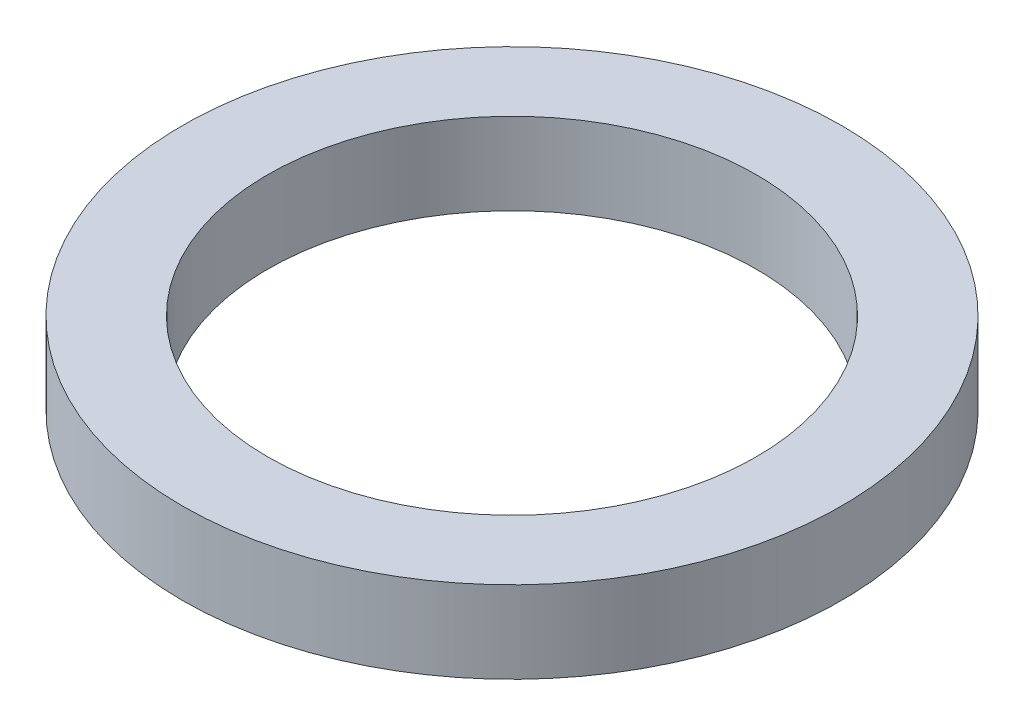
ISO-10303-21;
HEADER;
FILE_DESCRIPTION(('STEP AP214'),'2;1');
FILE_NAME('part.step','',(''),(''),'','','');
FILE_SCHEMA(('AUTOMOTIVE_DESIGN { 1 0 10303 214 1 1 1 1 }'));
ENDSEC;
DATA;
#1=APPLICATION_CONTEXT('core data for automotive mechanical design processes');
#2=APPLICATION_PROTOCOL_DEFINITION('international standard','automotive_design',2000,#1);
#3=PRODUCT_CONTEXT('',#1,'mechanical');
#4=PRODUCT('Part','Part','',(#3));
#5=PRODUCT_RELATED_PRODUCT_CATEGORY('part','',(#4));
#6=PRODUCT_DEFINITION_FORMATION('','',#4);
#7=PRODUCT_DEFINITION_CONTEXT('part definition',#1,'design');
#8=PRODUCT_DEFINITION('design','',#6,#7);
#9=PRODUCT_DEFINITION_SHAPE('','',#8);
#10=(LENGTH_UNIT() NAMED_UNIT(*) SI_UNIT(.MILLI.,.METRE.));
#11=(NAMED_UNIT(*) PLANE_ANGLE_UNIT() SI_UNIT($,.RADIAN.));
#12=(NAMED_UNIT(*) SI_UNIT($,.STERADIAN.) SOLID_ANGLE_UNIT());
#13=UNCERTAINTY_MEASURE_WITH_UNIT(LENGTH_MEASURE(1.E-05),#10,'distance_accuracy_value','');
#14=(GEOMETRIC_REPRESENTATION_CONTEXT(3) GLOBAL_UNCERTAINTY_ASSIGNED_CONTEXT((#13)) GLOBAL_UNIT_ASSIGNED_CONTEXT((#10,
#11,#12)) REPRESENTATION_CONTEXT('',''));
#15=CARTESIAN_POINT('',(0.,0.,0.));
#16=DIRECTION('',(0.,0.,1.));
#17=DIRECTION('',(1.,0.,0.));
#18=AXIS2_PLACEMENT_3D('',#15,#16,#17);
#19=CARTESIAN_POINT('',(0.,20.,0.));
#20=DIRECTION('',(0.,1.,0.));
#21=DIRECTION('',(0.,0.,1.));
#22=AXIS2_PLACEMENT_3D('',#19,#20,#21);
#23=PLANE('',#22);
#24=CARTESIAN_POINT('',(0.,20.,0.));
#25=DIRECTION('',(0.,1.,0.));
#26=DIRECTION('',(0.,0.,1.));
#27=AXIS2_PLACEMENT_3D('',#24,#25,#26);
#28=CIRCLE('',#27,80.5205962452002);
#29=CARTESIAN_POINT('',(0.,20.,80.5205962452002));
#30=VERTEX_POINT('',#29);
#31=EDGE_CURVE('E10',#30,#30,#28,.T.);
#32=ORIENTED_EDGE('',*,*,#31,.T.);
#33=EDGE_LOOP('',(#32));
#34=FACE_BOUND('',#33,.T.);
#35=CARTESIAN_POINT('',(0.,20.,0.));
#36=DIRECTION('',(0.,1.,0.));
#37=DIRECTION('',(0.,0.,1.));
#38=AXIS2_PLACEMENT_3D('',#35,#36,#37);
#39=CIRCLE('',#38,59.7056818163801);
#40=CARTESIAN_POINT('',(0.,20.,59.7056818163801));
#41=VERTEX_POINT('',#40);
#42=EDGE_CURVE('E48',#41,#41,#39,.T.);
#43=ORIENTED_EDGE('',*,*,#42,.F.);
#44=EDGE_LOOP('',(#43));
#45=FACE_BOUND('',#44,.T.);
#46=ADVANCED_FACE('F37',(#34,#45),#23,.T.);
#47=CARTESIAN_POINT('',(0.,0.,0.));
#48=DIRECTION('',(0.,1.,0.));
#49=DIRECTION('',(0.,0.,1.));
#50=AXIS2_PLACEMENT_3D('',#47,#48,#49);
#51=PLANE('',#50);
#52=CARTESIAN_POINT('',(0.,0.,0.));
#53=DIRECTION('',(0.,1.,0.));
#54=DIRECTION('',(0.,0.,1.));
#55=AXIS2_PLACEMENT_3D('',#52,#53,#54);
#56=CIRCLE('',#55,80.5205962452002);
#57=CARTESIAN_POINT('',(0.,0.,80.5205962452002));
#58=VERTEX_POINT('',#57);
#59=EDGE_CURVE('E41',#58,#58,#56,.T.);
#60=ORIENTED_EDGE('',*,*,#59,.F.);
#61=EDGE_LOOP('',(#60));
#62=FACE_BOUND('',#61,.T.);
#63=CARTESIAN_POINT('',(0.,0.,0.));
#64=DIRECTION('',(0.,1.,0.));
#65=DIRECTION('',(0.,0.,1.));
#66=AXIS2_PLACEMENT_3D('',#63,#64,#65);
#67=CIRCLE('',#66,59.7056818163801);
#68=CARTESIAN_POINT('',(0.,0.,59.7056818163801));
#69=VERTEX_POINT('',#68);
#70=EDGE_CURVE('E50',#69,#69,#67,.T.);
#71=ORIENTED_EDGE('',*,*,#70,.T.);
#72=EDGE_LOOP('',(#71));
#73=FACE_BOUND('',#72,.T.);
#74=ADVANCED_FACE('F60',(#62,#73),#51,.F.);
#75=CARTESIAN_POINT('',(0.,20.,0.));
#76=DIRECTION('',(0.,-1.,0.));
#77=DIRECTION('',(0.,0.,-1.));
#78=AXIS2_PLACEMENT_3D('',#75,#76,#77);
#79=CYLINDRICAL_SURFACE('',#78,80.5205962452002);
#80=ORIENTED_EDGE('',*,*,#31,.F.);
#81=EDGE_LOOP('',(#80));
#82=FACE_BOUND('',#81,.T.);
#83=ORIENTED_EDGE('',*,*,#59,.T.);
#84=EDGE_LOOP('',(#83));
#85=FACE_BOUND('',#84,.T.);
#86=ADVANCED_FACE('F39',(#82,#85),#79,.T.);
#87=CARTESIAN_POINT('',(0.,20.,0.));
#88=DIRECTION('',(0.,-1.,0.));
#89=DIRECTION('',(0.,0.,-1.));
#90=AXIS2_PLACEMENT_3D('',#87,#88,#89);
#91=CYLINDRICAL_SURFACE('',#90,59.7056818163801);
#92=ORIENTED_EDGE('',*,*,#42,.T.);
#93=EDGE_LOOP('',(#92));
#94=FACE_BOUND('',#93,.T.);
#95=ORIENTED_EDGE('',*,*,#70,.F.);
#96=EDGE_LOOP('',(#95));
#97=FACE_BOUND('',#96,.T.);
#98=ADVANCED_FACE('F56',(#94,#97),#91,.F.);
#99=CLOSED_SHELL('',(#46,#74,#86,#98));
#100=MANIFOLD_SOLID_BREP('B2',#99);
#101=ADVANCED_BREP_SHAPE_REPRESENTATION('',(#18,#100),#14);
#102=SHAPE_DEFINITION_REPRESENTATION(#9,#101);
ENDSEC;
END-ISO-10303-21;
